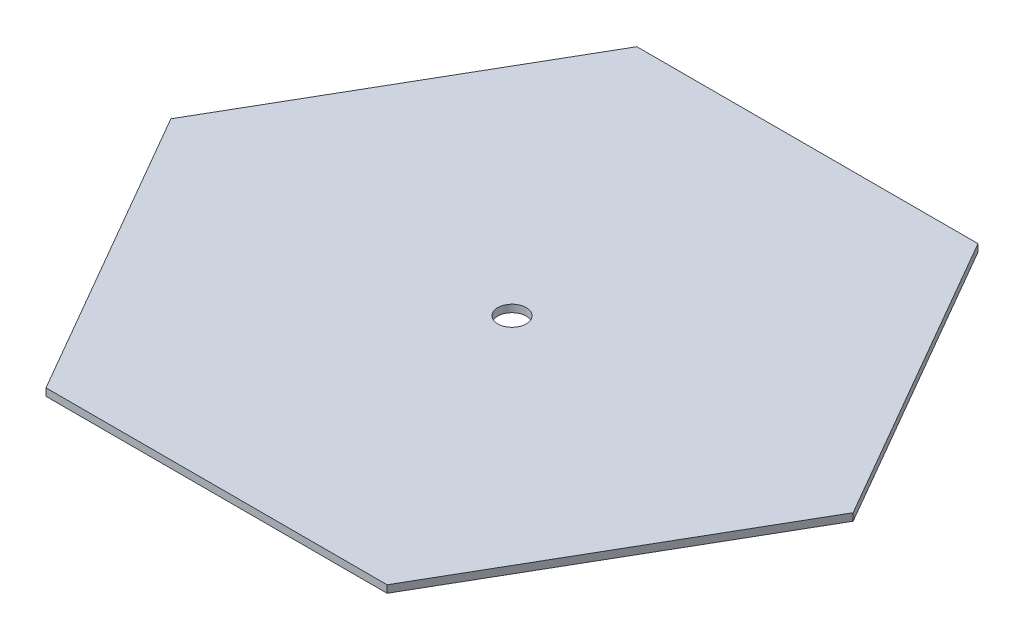
ISO-10303-21;
HEADER;
FILE_DESCRIPTION(('STEP AP214'),'2;1');
FILE_NAME('part.step','',(''),(''),'','','');
FILE_SCHEMA(('AUTOMOTIVE_DESIGN { 1 0 10303 214 1 1 1 1 }'));
ENDSEC;
DATA;
#1=APPLICATION_CONTEXT('core data for automotive mechanical design processes');
#2=APPLICATION_PROTOCOL_DEFINITION('international standard','automotive_design',2000,#1);
#3=PRODUCT_CONTEXT('',#1,'mechanical');
#4=PRODUCT('Part','Part','',(#3));
#5=PRODUCT_RELATED_PRODUCT_CATEGORY('part','',(#4));
#6=PRODUCT_DEFINITION_FORMATION('','',#4);
#7=PRODUCT_DEFINITION_CONTEXT('part definition',#1,'design');
#8=PRODUCT_DEFINITION('design','',#6,#7);
#9=PRODUCT_DEFINITION_SHAPE('','',#8);
#10=(LENGTH_UNIT() NAMED_UNIT(*) SI_UNIT(.MILLI.,.METRE.));
#11=(NAMED_UNIT(*) PLANE_ANGLE_UNIT() SI_UNIT($,.RADIAN.));
#12=(NAMED_UNIT(*) SI_UNIT($,.STERADIAN.) SOLID_ANGLE_UNIT());
#13=UNCERTAINTY_MEASURE_WITH_UNIT(LENGTH_MEASURE(1.E-05),#10,'distance_accuracy_value','');
#14=(GEOMETRIC_REPRESENTATION_CONTEXT(3) GLOBAL_UNCERTAINTY_ASSIGNED_CONTEXT((#13)) GLOBAL_UNIT_ASSIGNED_CONTEXT((#10,
#11,#12)) REPRESENTATION_CONTEXT('',''));
#15=CARTESIAN_POINT('',(0.,0.,0.));
#16=DIRECTION('',(0.,0.,1.));
#17=DIRECTION('',(1.,0.,0.));
#18=AXIS2_PLACEMENT_3D('',#15,#16,#17);
#19=CARTESIAN_POINT('',(138.56406460551,3.,0.));
#20=DIRECTION('',(-0.866025403784438,0.,0.5));
#21=DIRECTION('',(0.5,0.,0.866025403784439));
#22=AXIS2_PLACEMENT_3D('',#19,#20,#21);
#23=PLANE('',#22);
#24=DIRECTION('',(-0.5,0.,-0.866025403784439));
#25=VECTOR('',#24,1.);
#26=CARTESIAN_POINT('',(138.56406460551,0.,0.));
#27=LINE('',#26,#25);
#28=CARTESIAN_POINT('',(138.56406460551,0.,0.));
#29=VERTEX_POINT('',#28);
#30=CARTESIAN_POINT('',(69.2820323027551,0.,-120.));
#31=VERTEX_POINT('',#30);
#32=EDGE_CURVE('E121',#29,#31,#27,.T.);
#33=ORIENTED_EDGE('',*,*,#32,.T.);
#34=DIRECTION('',(0.,-1.,0.));
#35=VECTOR('',#34,1.);
#36=CARTESIAN_POINT('',(69.2820323027551,3.,-120.));
#37=LINE('',#36,#35);
#38=CARTESIAN_POINT('',(69.2820323027551,3.,-120.));
#39=VERTEX_POINT('',#38);
#40=EDGE_CURVE('E11',#39,#31,#37,.T.);
#41=ORIENTED_EDGE('',*,*,#40,.F.);
#42=DIRECTION('',(-0.5,0.,-0.866025403784439));
#43=VECTOR('',#42,1.);
#44=CARTESIAN_POINT('',(138.56406460551,3.,0.));
#45=LINE('',#44,#43);
#46=CARTESIAN_POINT('',(138.56406460551,3.,0.));
#47=VERTEX_POINT('',#46);
#48=EDGE_CURVE('E132',#47,#39,#45,.T.);
#49=ORIENTED_EDGE('',*,*,#48,.F.);
#50=DIRECTION('',(0.,-1.,0.));
#51=VECTOR('',#50,1.);
#52=CARTESIAN_POINT('',(138.56406460551,3.,0.));
#53=LINE('',#52,#51);
#54=EDGE_CURVE('E117',#47,#29,#53,.T.);
#55=ORIENTED_EDGE('',*,*,#54,.T.);
#56=EDGE_LOOP('',(#33,#41,#49,#55));
#57=FACE_BOUND('',#56,.T.);
#58=ADVANCED_FACE('F37',(#57),#23,.F.);
#59=CARTESIAN_POINT('',(69.2820323027551,3.,-120.));
#60=DIRECTION('',(0.,0.,1.));
#61=DIRECTION('',(1.,0.,0.));
#62=AXIS2_PLACEMENT_3D('',#59,#60,#61);
#63=PLANE('',#62);
#64=DIRECTION('',(-1.,0.,0.));
#65=VECTOR('',#64,1.);
#66=CARTESIAN_POINT('',(69.2820323027551,0.,-120.));
#67=LINE('',#66,#65);
#68=CARTESIAN_POINT('',(-69.2820323027551,0.,-120.));
#69=VERTEX_POINT('',#68);
#70=EDGE_CURVE('E124',#31,#69,#67,.T.);
#71=ORIENTED_EDGE('',*,*,#70,.T.);
#72=DIRECTION('',(0.,-1.,0.));
#73=VECTOR('',#72,1.);
#74=CARTESIAN_POINT('',(-69.2820323027551,3.,-120.));
#75=LINE('',#74,#73);
#76=CARTESIAN_POINT('',(-69.2820323027551,3.,-120.));
#77=VERTEX_POINT('',#76);
#78=EDGE_CURVE('E45',#77,#69,#75,.T.);
#79=ORIENTED_EDGE('',*,*,#78,.F.);
#80=DIRECTION('',(-1.,0.,0.));
#81=VECTOR('',#80,1.);
#82=CARTESIAN_POINT('',(69.2820323027551,3.,-120.));
#83=LINE('',#82,#81);
#84=EDGE_CURVE('E90',#39,#77,#83,.T.);
#85=ORIENTED_EDGE('',*,*,#84,.F.);
#86=ORIENTED_EDGE('',*,*,#40,.T.);
#87=EDGE_LOOP('',(#71,#79,#85,#86));
#88=FACE_BOUND('',#87,.T.);
#89=ADVANCED_FACE('F157',(#88),#63,.F.);
#90=CARTESIAN_POINT('',(-69.2820323027551,3.,-120.));
#91=DIRECTION('',(0.866025403784439,0.,0.5));
#92=DIRECTION('',(0.5,0.,-0.866025403784439));
#93=AXIS2_PLACEMENT_3D('',#90,#91,#92);
#94=PLANE('',#93);
#95=DIRECTION('',(-0.5,0.,0.866025403784439));
#96=VECTOR('',#95,1.);
#97=CARTESIAN_POINT('',(-69.2820323027551,0.,-120.));
#98=LINE('',#97,#96);
#99=CARTESIAN_POINT('',(-138.56406460551,0.,0.));
#100=VERTEX_POINT('',#99);
#101=EDGE_CURVE('E127',#69,#100,#98,.T.);
#102=ORIENTED_EDGE('',*,*,#101,.T.);
#103=DIRECTION('',(0.,-1.,0.));
#104=VECTOR('',#103,1.);
#105=CARTESIAN_POINT('',(-138.56406460551,3.,0.));
#106=LINE('',#105,#104);
#107=CARTESIAN_POINT('',(-138.56406460551,3.,0.));
#108=VERTEX_POINT('',#107);
#109=EDGE_CURVE('E112',#108,#100,#106,.T.);
#110=ORIENTED_EDGE('',*,*,#109,.F.);
#111=DIRECTION('',(-0.5,0.,0.866025403784439));
#112=VECTOR('',#111,1.);
#113=CARTESIAN_POINT('',(-69.2820323027551,3.,-120.));
#114=LINE('',#113,#112);
#115=EDGE_CURVE('E103',#77,#108,#114,.T.);
#116=ORIENTED_EDGE('',*,*,#115,.F.);
#117=ORIENTED_EDGE('',*,*,#78,.T.);
#118=EDGE_LOOP('',(#102,#110,#116,#117));
#119=FACE_BOUND('',#118,.T.);
#120=ADVANCED_FACE('F138',(#119),#94,.F.);
#121=CARTESIAN_POINT('',(-138.56406460551,3.,0.));
#122=DIRECTION('',(0.866025403784438,0.,-0.5));
#123=DIRECTION('',(-0.5,0.,-0.866025403784438));
#124=AXIS2_PLACEMENT_3D('',#121,#122,#123);
#125=PLANE('',#124);
#126=DIRECTION('',(0.5,0.,0.866025403784438));
#127=VECTOR('',#126,1.);
#128=CARTESIAN_POINT('',(-138.56406460551,0.,0.));
#129=LINE('',#128,#127);
#130=CARTESIAN_POINT('',(-69.282032302755,0.,120.));
#131=VERTEX_POINT('',#130);
#132=EDGE_CURVE('E111',#100,#131,#129,.T.);
#133=ORIENTED_EDGE('',*,*,#132,.T.);
#134=DIRECTION('',(0.,-1.,0.));
#135=VECTOR('',#134,1.);
#136=CARTESIAN_POINT('',(-69.282032302755,3.,120.));
#137=LINE('',#136,#135);
#138=CARTESIAN_POINT('',(-69.282032302755,3.,120.));
#139=VERTEX_POINT('',#138);
#140=EDGE_CURVE('E108',#139,#131,#137,.T.);
#141=ORIENTED_EDGE('',*,*,#140,.F.);
#142=DIRECTION('',(0.5,0.,0.866025403784438));
#143=VECTOR('',#142,1.);
#144=CARTESIAN_POINT('',(-138.56406460551,3.,0.));
#145=LINE('',#144,#143);
#146=EDGE_CURVE('E97',#108,#139,#145,.T.);
#147=ORIENTED_EDGE('',*,*,#146,.F.);
#148=ORIENTED_EDGE('',*,*,#109,.T.);
#149=EDGE_LOOP('',(#133,#141,#147,#148));
#150=FACE_BOUND('',#149,.T.);
#151=ADVANCED_FACE('F109',(#150),#125,.F.);
#152=CARTESIAN_POINT('',(-69.282032302755,3.,120.));
#153=DIRECTION('',(0.,0.,-1.));
#154=DIRECTION('',(-1.,0.,0.));
#155=AXIS2_PLACEMENT_3D('',#152,#153,#154);
#156=PLANE('',#155);
#157=DIRECTION('',(1.,0.,0.));
#158=VECTOR('',#157,1.);
#159=CARTESIAN_POINT('',(-69.282032302755,0.,120.));
#160=LINE('',#159,#158);
#161=CARTESIAN_POINT('',(69.2820323027551,0.,120.));
#162=VERTEX_POINT('',#161);
#163=EDGE_CURVE('E76',#131,#162,#160,.T.);
#164=ORIENTED_EDGE('',*,*,#163,.T.);
#165=DIRECTION('',(0.,-1.,0.));
#166=VECTOR('',#165,1.);
#167=CARTESIAN_POINT('',(69.2820323027551,3.,120.));
#168=LINE('',#167,#166);
#169=CARTESIAN_POINT('',(69.2820323027551,3.,120.));
#170=VERTEX_POINT('',#169);
#171=EDGE_CURVE('E113',#170,#162,#168,.T.);
#172=ORIENTED_EDGE('',*,*,#171,.F.);
#173=DIRECTION('',(1.,0.,0.));
#174=VECTOR('',#173,1.);
#175=CARTESIAN_POINT('',(-69.282032302755,3.,120.));
#176=LINE('',#175,#174);
#177=EDGE_CURVE('E101',#139,#170,#176,.T.);
#178=ORIENTED_EDGE('',*,*,#177,.F.);
#179=ORIENTED_EDGE('',*,*,#140,.T.);
#180=EDGE_LOOP('',(#164,#172,#178,#179));
#181=FACE_BOUND('',#180,.T.);
#182=ADVANCED_FACE('F115',(#181),#156,.F.);
#183=CARTESIAN_POINT('',(69.2820323027551,3.,120.));
#184=DIRECTION('',(-0.866025403784439,0.,-0.5));
#185=DIRECTION('',(-0.5,0.,0.866025403784439));
#186=AXIS2_PLACEMENT_3D('',#183,#184,#185);
#187=PLANE('',#186);
#188=DIRECTION('',(0.5,0.,-0.866025403784439));
#189=VECTOR('',#188,1.);
#190=CARTESIAN_POINT('',(69.2820323027551,0.,120.));
#191=LINE('',#190,#189);
#192=EDGE_CURVE('E82',#162,#29,#191,.T.);
#193=ORIENTED_EDGE('',*,*,#192,.T.);
#194=ORIENTED_EDGE('',*,*,#54,.F.);
#195=DIRECTION('',(0.5,0.,-0.866025403784439));
#196=VECTOR('',#195,1.);
#197=CARTESIAN_POINT('',(69.2820323027551,3.,120.));
#198=LINE('',#197,#196);
#199=EDGE_CURVE('E53',#170,#47,#198,.T.);
#200=ORIENTED_EDGE('',*,*,#199,.F.);
#201=ORIENTED_EDGE('',*,*,#171,.T.);
#202=EDGE_LOOP('',(#193,#194,#200,#201));
#203=FACE_BOUND('',#202,.T.);
#204=ADVANCED_FACE('F145',(#203),#187,.F.);
#205=CARTESIAN_POINT('',(0.,3.,0.));
#206=DIRECTION('',(0.,1.,0.));
#207=DIRECTION('',(0.,0.,1.));
#208=AXIS2_PLACEMENT_3D('',#205,#206,#207);
#209=PLANE('',#208);
#210=CARTESIAN_POINT('',(0.,3.,0.));
#211=DIRECTION('',(0.,1.,0.));
#212=DIRECTION('',(0.,0.,1.));
#213=AXIS2_PLACEMENT_3D('',#210,#211,#212);
#214=CIRCLE('',#213,5.7531791745923);
#215=CARTESIAN_POINT('',(0.,3.,5.7531791745923));
#216=VERTEX_POINT('',#215);
#217=EDGE_CURVE('E214',#216,#216,#214,.T.);
#218=ORIENTED_EDGE('',*,*,#217,.F.);
#219=EDGE_LOOP('',(#218));
#220=FACE_BOUND('',#219,.T.);
#221=ORIENTED_EDGE('',*,*,#48,.T.);
#222=ORIENTED_EDGE('',*,*,#84,.T.);
#223=ORIENTED_EDGE('',*,*,#115,.T.);
#224=ORIENTED_EDGE('',*,*,#146,.T.);
#225=ORIENTED_EDGE('',*,*,#177,.T.);
#226=ORIENTED_EDGE('',*,*,#199,.T.);
#227=EDGE_LOOP('',(#221,#222,#223,#224,#225,#226));
#228=FACE_BOUND('',#227,.T.);
#229=ADVANCED_FACE('F99',(#220,#228),#209,.T.);
#230=CARTESIAN_POINT('',(0.,0.,0.));
#231=DIRECTION('',(0.,1.,0.));
#232=DIRECTION('',(0.,0.,1.));
#233=AXIS2_PLACEMENT_3D('',#230,#231,#232);
#234=PLANE('',#233);
#235=CARTESIAN_POINT('',(0.,0.,0.));
#236=DIRECTION('',(0.,1.,0.));
#237=DIRECTION('',(0.,0.,1.));
#238=AXIS2_PLACEMENT_3D('',#235,#236,#237);
#239=CIRCLE('',#238,5.7531791745923);
#240=CARTESIAN_POINT('',(0.,0.,5.7531791745923));
#241=VERTEX_POINT('',#240);
#242=EDGE_CURVE('E125',#241,#241,#239,.T.);
#243=ORIENTED_EDGE('',*,*,#242,.T.);
#244=EDGE_LOOP('',(#243));
#245=FACE_BOUND('',#244,.T.);
#246=ORIENTED_EDGE('',*,*,#32,.F.);
#247=ORIENTED_EDGE('',*,*,#192,.F.);
#248=ORIENTED_EDGE('',*,*,#163,.F.);
#249=ORIENTED_EDGE('',*,*,#132,.F.);
#250=ORIENTED_EDGE('',*,*,#101,.F.);
#251=ORIENTED_EDGE('',*,*,#70,.F.);
#252=EDGE_LOOP('',(#246,#247,#248,#249,#250,#251));
#253=FACE_BOUND('',#252,.T.);
#254=ADVANCED_FACE('F141',(#245,#253),#234,.F.);
#255=CARTESIAN_POINT('',(0.,0.,0.));
#256=DIRECTION('',(0.,1.,0.));
#257=DIRECTION('',(0.,0.,1.));
#258=AXIS2_PLACEMENT_3D('',#255,#256,#257);
#259=CYLINDRICAL_SURFACE('',#258,5.7531791745923);
#260=ORIENTED_EDGE('',*,*,#242,.F.);
#261=EDGE_LOOP('',(#260));
#262=FACE_BOUND('',#261,.T.);
#263=ORIENTED_EDGE('',*,*,#217,.T.);
#264=EDGE_LOOP('',(#263));
#265=FACE_BOUND('',#264,.T.);
#266=ADVANCED_FACE('F195',(#262,#265),#259,.F.);
#267=CLOSED_SHELL('',(#58,#89,#120,#151,#182,#204,#229,#254,#266));
#268=MANIFOLD_SOLID_BREP('B2',#267);
#269=ADVANCED_BREP_SHAPE_REPRESENTATION('',(#18,#268),#14);
#270=SHAPE_DEFINITION_REPRESENTATION(#9,#269);
ENDSEC;
END-ISO-10303-21;
